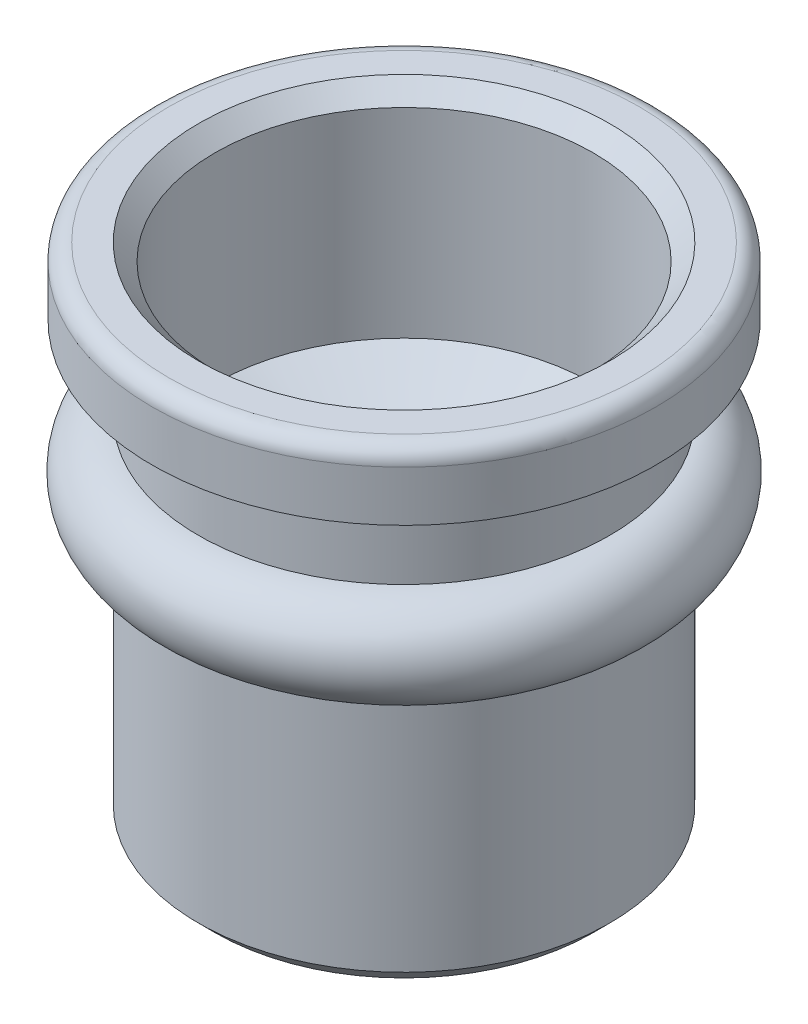
ISO-10303-21;
HEADER;
FILE_DESCRIPTION(('STEP AP214'),'2;1');
FILE_NAME('part.step','',(''),(''),'','','');
FILE_SCHEMA(('AUTOMOTIVE_DESIGN { 1 0 10303 214 1 1 1 1 }'));
ENDSEC;
DATA;
#1=APPLICATION_CONTEXT('core data for automotive mechanical design processes');
#2=APPLICATION_PROTOCOL_DEFINITION('international standard','automotive_design',2000,#1);
#3=PRODUCT_CONTEXT('',#1,'mechanical');
#4=PRODUCT('Part','Part','',(#3));
#5=PRODUCT_RELATED_PRODUCT_CATEGORY('part','',(#4));
#6=PRODUCT_DEFINITION_FORMATION('','',#4);
#7=PRODUCT_DEFINITION_CONTEXT('part definition',#1,'design');
#8=PRODUCT_DEFINITION('design','',#6,#7);
#9=PRODUCT_DEFINITION_SHAPE('','',#8);
#10=(LENGTH_UNIT() NAMED_UNIT(*) SI_UNIT(.MILLI.,.METRE.));
#11=(NAMED_UNIT(*) PLANE_ANGLE_UNIT() SI_UNIT($,.RADIAN.));
#12=(NAMED_UNIT(*) SI_UNIT($,.STERADIAN.) SOLID_ANGLE_UNIT());
#13=UNCERTAINTY_MEASURE_WITH_UNIT(LENGTH_MEASURE(1.E-05),#10,'distance_accuracy_value','');
#14=(GEOMETRIC_REPRESENTATION_CONTEXT(3) GLOBAL_UNCERTAINTY_ASSIGNED_CONTEXT((#13)) GLOBAL_UNIT_ASSIGNED_CONTEXT((#10,
#11,#12)) REPRESENTATION_CONTEXT('',''));
#15=CARTESIAN_POINT('',(0.,0.,0.));
#16=DIRECTION('',(0.,0.,1.));
#17=DIRECTION('',(1.,0.,0.));
#18=AXIS2_PLACEMENT_3D('',#15,#16,#17);
#19=CARTESIAN_POINT('',(0.,0.,0.));
#20=DIRECTION('',(0.,-1.,0.));
#21=DIRECTION('',(0.,0.,-1.));
#22=AXIS2_PLACEMENT_3D('',#19,#20,#21);
#23=CYLINDRICAL_SURFACE('',#22,2.45);
#24=CARTESIAN_POINT('',(0.,0.200000000000002,0.));
#25=DIRECTION('',(0.,-1.,0.));
#26=DIRECTION('',(0.,0.,-1.));
#27=AXIS2_PLACEMENT_3D('',#24,#25,#26);
#28=CIRCLE('',#27,2.45);
#29=CARTESIAN_POINT('',(0.,0.200000000000002,-2.45));
#30=VERTEX_POINT('',#29);
#31=EDGE_CURVE('E48',#30,#30,#28,.F.);
#32=ORIENTED_EDGE('',*,*,#31,.T.);
#33=EDGE_LOOP('',(#32));
#34=FACE_BOUND('',#33,.T.);
#35=CARTESIAN_POINT('',(0.,3.08,0.));
#36=DIRECTION('',(0.,-1.,0.));
#37=DIRECTION('',(0.,0.,-1.));
#38=AXIS2_PLACEMENT_3D('',#35,#36,#37);
#39=CIRCLE('',#38,2.45);
#40=CARTESIAN_POINT('',(0.,3.08,-2.45));
#41=VERTEX_POINT('',#40);
#42=EDGE_CURVE('E84',#41,#41,#39,.T.);
#43=ORIENTED_EDGE('',*,*,#42,.T.);
#44=EDGE_LOOP('',(#43));
#45=FACE_BOUND('',#44,.T.);
#46=ADVANCED_FACE('F36',(#34,#45),#23,.T.);
#47=CARTESIAN_POINT('',(0.,5.2,0.));
#48=DIRECTION('',(0.,-1.,0.));
#49=DIRECTION('',(0.,0.,-1.));
#50=AXIS2_PLACEMENT_3D('',#47,#48,#49);
#51=CIRCLE('',#50,2.45);
#52=CARTESIAN_POINT('',(0.,5.2,-2.45));
#53=VERTEX_POINT('',#52);
#54=EDGE_CURVE('E74',#53,#53,#51,.T.);
#55=ORIENTED_EDGE('',*,*,#54,.T.);
#56=EDGE_LOOP('',(#55));
#57=FACE_BOUND('',#56,.T.);
#58=CARTESIAN_POINT('',(0.,4.2,0.));
#59=DIRECTION('',(0.,-1.,0.));
#60=DIRECTION('',(0.,0.,-1.));
#61=AXIS2_PLACEMENT_3D('',#58,#59,#60);
#62=CIRCLE('',#61,2.45);
#63=CARTESIAN_POINT('',(0.,4.2,-2.45));
#64=VERTEX_POINT('',#63);
#65=EDGE_CURVE('E87',#64,#64,#62,.T.);
#66=ORIENTED_EDGE('',*,*,#65,.F.);
#67=EDGE_LOOP('',(#66));
#68=FACE_BOUND('',#67,.T.);
#69=ADVANCED_FACE('F93',(#57,#68),#23,.T.);
#70=CARTESIAN_POINT('',(0.,0.,0.));
#71=DIRECTION('',(0.,-1.,0.));
#72=DIRECTION('',(0.,0.,-1.));
#73=AXIS2_PLACEMENT_3D('',#70,#71,#72);
#74=CYLINDRICAL_SURFACE('',#73,1.24999999999999);
#75=CARTESIAN_POINT('',(0.,0.149999999999994,0.));
#76=DIRECTION('',(0.,-1.,0.));
#77=DIRECTION('',(0.,0.,-1.));
#78=AXIS2_PLACEMENT_3D('',#75,#76,#77);
#79=CIRCLE('',#78,1.24999999999999);
#80=CARTESIAN_POINT('',(0.,0.149999999999994,-1.24999999999999));
#81=VERTEX_POINT('',#80);
#82=EDGE_CURVE('E65',#81,#81,#79,.T.);
#83=ORIENTED_EDGE('',*,*,#82,.T.);
#84=EDGE_LOOP('',(#83));
#85=FACE_BOUND('',#84,.T.);
#86=CARTESIAN_POINT('',(0.,3.,0.));
#87=DIRECTION('',(0.,1.,0.));
#88=DIRECTION('',(0.,0.,1.));
#89=AXIS2_PLACEMENT_3D('',#86,#87,#88);
#90=CIRCLE('',#89,1.24999999999999);
#91=CARTESIAN_POINT('',(0.,3.,1.24999999999999));
#92=VERTEX_POINT('',#91);
#93=EDGE_CURVE('E58',#92,#92,#90,.F.);
#94=ORIENTED_EDGE('',*,*,#93,.F.);
#95=EDGE_LOOP('',(#94));
#96=FACE_BOUND('',#95,.T.);
#97=ADVANCED_FACE('F95',(#85,#96),#74,.F.);
#98=CARTESIAN_POINT('',(0.,0.,0.));
#99=DIRECTION('',(0.,-1.,0.));
#100=DIRECTION('',(0.,0.,-1.));
#101=AXIS2_PLACEMENT_3D('',#98,#99,#100);
#102=PLANE('',#101);
#103=CARTESIAN_POINT('',(0.,0.,0.));
#104=DIRECTION('',(0.,-1.,0.));
#105=DIRECTION('',(0.,0.,-1.));
#106=AXIS2_PLACEMENT_3D('',#103,#104,#105);
#107=CIRCLE('',#106,2.25);
#108=CARTESIAN_POINT('',(0.,0.,-2.25));
#109=VERTEX_POINT('',#108);
#110=EDGE_CURVE('E52',#109,#109,#107,.T.);
#111=ORIENTED_EDGE('',*,*,#110,.T.);
#112=EDGE_LOOP('',(#111));
#113=FACE_BOUND('',#112,.T.);
#114=CARTESIAN_POINT('',(0.,0.,0.));
#115=DIRECTION('',(0.,-1.,0.));
#116=DIRECTION('',(0.,0.,-1.));
#117=AXIS2_PLACEMENT_3D('',#114,#115,#116);
#118=CIRCLE('',#117,1.39999999999999);
#119=CARTESIAN_POINT('',(0.,0.,-1.39999999999999));
#120=VERTEX_POINT('',#119);
#121=EDGE_CURVE('E57',#120,#120,#118,.F.);
#122=ORIENTED_EDGE('',*,*,#121,.T.);
#123=EDGE_LOOP('',(#122));
#124=FACE_BOUND('',#123,.T.);
#125=ADVANCED_FACE('F102',(#113,#124),#102,.T.);
#126=CARTESIAN_POINT('',(2.45,5.2,0.));
#127=DIRECTION('',(0.,-1.,0.));
#128=DIRECTION('',(0.,0.,-1.));
#129=AXIS2_PLACEMENT_3D('',#126,#127,#128);
#130=PLANE('',#129);
#131=CARTESIAN_POINT('',(0.,5.2,0.));
#132=DIRECTION('',(0.,-1.,0.));
#133=DIRECTION('',(0.,0.,-1.));
#134=AXIS2_PLACEMENT_3D('',#131,#132,#133);
#135=CIRCLE('',#134,3.);
#136=CARTESIAN_POINT('',(0.,5.2,-3.));
#137=VERTEX_POINT('',#136);
#138=EDGE_CURVE('E61',#137,#137,#135,.T.);
#139=ORIENTED_EDGE('',*,*,#138,.T.);
#140=EDGE_LOOP('',(#139));
#141=FACE_BOUND('',#140,.T.);
#142=ORIENTED_EDGE('',*,*,#54,.F.);
#143=EDGE_LOOP('',(#142));
#144=FACE_BOUND('',#143,.T.);
#145=ADVANCED_FACE('F108',(#141,#144),#130,.T.);
#146=CARTESIAN_POINT('',(0.,0.,0.));
#147=DIRECTION('',(0.,-1.,0.));
#148=DIRECTION('',(0.,0.,-1.));
#149=AXIS2_PLACEMENT_3D('',#146,#147,#148);
#150=CYLINDRICAL_SURFACE('',#149,3.);
#151=CARTESIAN_POINT('',(0.,5.8,0.));
#152=DIRECTION('',(0.,1.,0.));
#153=DIRECTION('',(0.,0.,1.));
#154=AXIS2_PLACEMENT_3D('',#151,#152,#153);
#155=CIRCLE('',#154,3.);
#156=CARTESIAN_POINT('',(0.,5.8,3.));
#157=VERTEX_POINT('',#156);
#158=EDGE_CURVE('E71',#157,#157,#155,.F.);
#159=ORIENTED_EDGE('',*,*,#158,.T.);
#160=EDGE_LOOP('',(#159));
#161=FACE_BOUND('',#160,.T.);
#162=ORIENTED_EDGE('',*,*,#138,.F.);
#163=EDGE_LOOP('',(#162));
#164=FACE_BOUND('',#163,.T.);
#165=ADVANCED_FACE('F162',(#161,#164),#150,.T.);
#166=CARTESIAN_POINT('',(3.,6.,0.));
#167=DIRECTION('',(0.,1.,0.));
#168=DIRECTION('',(0.,0.,1.));
#169=AXIS2_PLACEMENT_3D('',#166,#167,#168);
#170=PLANE('',#169);
#171=CARTESIAN_POINT('',(0.,6.,0.));
#172=DIRECTION('',(0.,1.,0.));
#173=DIRECTION('',(0.,0.,1.));
#174=AXIS2_PLACEMENT_3D('',#171,#172,#173);
#175=CIRCLE('',#174,2.45);
#176=CARTESIAN_POINT('',(0.,6.,2.45));
#177=VERTEX_POINT('',#176);
#178=EDGE_CURVE('E10',#177,#177,#175,.F.);
#179=ORIENTED_EDGE('',*,*,#178,.T.);
#180=EDGE_LOOP('',(#179));
#181=FACE_BOUND('',#180,.T.);
#182=CARTESIAN_POINT('',(0.,6.,0.));
#183=DIRECTION('',(0.,1.,0.));
#184=DIRECTION('',(0.,0.,1.));
#185=AXIS2_PLACEMENT_3D('',#182,#183,#184);
#186=CIRCLE('',#185,2.8);
#187=CARTESIAN_POINT('',(0.,6.,2.8));
#188=VERTEX_POINT('',#187);
#189=EDGE_CURVE('E68',#188,#188,#186,.T.);
#190=ORIENTED_EDGE('',*,*,#189,.T.);
#191=EDGE_LOOP('',(#190));
#192=FACE_BOUND('',#191,.T.);
#193=ADVANCED_FACE('F117',(#181,#192),#170,.T.);
#194=CARTESIAN_POINT('',(0.,5.8,0.));
#195=DIRECTION('',(0.,1.,0.));
#196=DIRECTION('',(0.,0.,1.));
#197=AXIS2_PLACEMENT_3D('',#194,#195,#196);
#198=TOROIDAL_SURFACE('',#197,2.8,0.2);
#199=ORIENTED_EDGE('',*,*,#189,.F.);
#200=EDGE_LOOP('',(#199));
#201=FACE_BOUND('',#200,.T.);
#202=ORIENTED_EDGE('',*,*,#158,.F.);
#203=EDGE_LOOP('',(#202));
#204=FACE_BOUND('',#203,.T.);
#205=ADVANCED_FACE('F113',(#201,#204),#198,.T.);
#206=CARTESIAN_POINT('',(0.,0.149999999999994,0.));
#207=DIRECTION('',(0.,-1.,0.));
#208=DIRECTION('',(0.,0.,-1.));
#209=AXIS2_PLACEMENT_3D('',#206,#207,#208);
#210=CONICAL_SURFACE('',#209,1.24999999999999,0.785398163397451);
#211=ORIENTED_EDGE('',*,*,#121,.F.);
#212=EDGE_LOOP('',(#211));
#213=FACE_BOUND('',#212,.T.);
#214=ORIENTED_EDGE('',*,*,#82,.F.);
#215=EDGE_LOOP('',(#214));
#216=FACE_BOUND('',#215,.T.);
#217=ADVANCED_FACE('F116',(#213,#216),#210,.F.);
#218=CARTESIAN_POINT('',(1.35,3.,0.));
#219=DIRECTION('',(0.,1.,0.));
#220=DIRECTION('',(0.,0.,1.));
#221=AXIS2_PLACEMENT_3D('',#218,#219,#220);
#222=PLANE('',#221);
#223=CARTESIAN_POINT('',(0.,3.,0.));
#224=DIRECTION('',(0.,1.,0.));
#225=DIRECTION('',(0.,0.,1.));
#226=AXIS2_PLACEMENT_3D('',#223,#224,#225);
#227=CIRCLE('',#226,1.35);
#228=CARTESIAN_POINT('',(0.,3.,1.35));
#229=VERTEX_POINT('',#228);
#230=EDGE_CURVE('E81',#229,#229,#227,.T.);
#231=ORIENTED_EDGE('',*,*,#230,.T.);
#232=EDGE_LOOP('',(#231));
#233=FACE_BOUND('',#232,.T.);
#234=ORIENTED_EDGE('',*,*,#93,.T.);
#235=EDGE_LOOP('',(#234));
#236=FACE_BOUND('',#235,.T.);
#237=ADVANCED_FACE('F124',(#233,#236),#222,.T.);
#238=CARTESIAN_POINT('',(0.,6.,0.));
#239=DIRECTION('',(0.,1.,0.));
#240=DIRECTION('',(0.,0.,1.));
#241=AXIS2_PLACEMENT_3D('',#238,#239,#240);
#242=CYLINDRICAL_SURFACE('',#241,2.25);
#243=CARTESIAN_POINT('',(0.,5.8,0.));
#244=DIRECTION('',(0.,1.,0.));
#245=DIRECTION('',(0.,0.,1.));
#246=AXIS2_PLACEMENT_3D('',#243,#244,#245);
#247=CIRCLE('',#246,2.25);
#248=CARTESIAN_POINT('',(0.,5.8,2.25));
#249=VERTEX_POINT('',#248);
#250=EDGE_CURVE('E44',#249,#249,#247,.T.);
#251=ORIENTED_EDGE('',*,*,#250,.T.);
#252=EDGE_LOOP('',(#251));
#253=FACE_BOUND('',#252,.T.);
#254=CARTESIAN_POINT('',(0.,3.4196768923395,0.));
#255=DIRECTION('',(0.,1.,0.));
#256=DIRECTION('',(0.,0.,1.));
#257=AXIS2_PLACEMENT_3D('',#254,#255,#256);
#258=CIRCLE('',#257,2.25);
#259=CARTESIAN_POINT('',(0.,3.4196768923395,2.25));
#260=VERTEX_POINT('',#259);
#261=EDGE_CURVE('E62',#260,#260,#258,.T.);
#262=ORIENTED_EDGE('',*,*,#261,.F.);
#263=EDGE_LOOP('',(#262));
#264=FACE_BOUND('',#263,.T.);
#265=ADVANCED_FACE('F150',(#253,#264),#242,.F.);
#266=CARTESIAN_POINT('',(0.,3.,0.));
#267=DIRECTION('',(0.,1.,0.));
#268=DIRECTION('',(0.,0.,1.));
#269=AXIS2_PLACEMENT_3D('',#266,#267,#268);
#270=CONICAL_SURFACE('',#269,1.35,1.13446401379632);
#271=ORIENTED_EDGE('',*,*,#261,.T.);
#272=EDGE_LOOP('',(#271));
#273=FACE_BOUND('',#272,.T.);
#274=ORIENTED_EDGE('',*,*,#230,.F.);
#275=EDGE_LOOP('',(#274));
#276=FACE_BOUND('',#275,.T.);
#277=ADVANCED_FACE('F136',(#273,#276),#270,.F.);
#278=CARTESIAN_POINT('',(0.,3.64,0.));
#279=DIRECTION('',(0.,-1.,0.));
#280=DIRECTION('',(0.,0.,-1.));
#281=AXIS2_PLACEMENT_3D('',#278,#279,#280);
#282=TOROIDAL_SURFACE('',#281,2.45,0.56);
#283=ORIENTED_EDGE('',*,*,#42,.F.);
#284=EDGE_LOOP('',(#283));
#285=FACE_BOUND('',#284,.T.);
#286=ORIENTED_EDGE('',*,*,#65,.T.);
#287=EDGE_LOOP('',(#286));
#288=FACE_BOUND('',#287,.T.);
#289=ADVANCED_FACE('F91',(#285,#288),#282,.T.);
#290=CARTESIAN_POINT('',(0.,0.,0.));
#291=DIRECTION('',(0.,1.,0.));
#292=DIRECTION('',(0.,0.,1.));
#293=AXIS2_PLACEMENT_3D('',#290,#291,#292);
#294=CONICAL_SURFACE('',#293,2.25,0.785398163397444);
#295=ORIENTED_EDGE('',*,*,#31,.F.);
#296=EDGE_LOOP('',(#295));
#297=FACE_BOUND('',#296,.T.);
#298=ORIENTED_EDGE('',*,*,#110,.F.);
#299=EDGE_LOOP('',(#298));
#300=FACE_BOUND('',#299,.T.);
#301=ADVANCED_FACE('F126',(#297,#300),#294,.T.);
#302=CARTESIAN_POINT('',(0.,5.8,0.));
#303=DIRECTION('',(0.,1.,0.));
#304=DIRECTION('',(0.,0.,1.));
#305=AXIS2_PLACEMENT_3D('',#302,#303,#304);
#306=CONICAL_SURFACE('',#305,2.25,0.785398163397455);
#307=ORIENTED_EDGE('',*,*,#178,.F.);
#308=EDGE_LOOP('',(#307));
#309=FACE_BOUND('',#308,.T.);
#310=ORIENTED_EDGE('',*,*,#250,.F.);
#311=EDGE_LOOP('',(#310));
#312=FACE_BOUND('',#311,.T.);
#313=ADVANCED_FACE('F39',(#309,#312),#306,.F.);
#314=CLOSED_SHELL('',(#46,#69,#97,#125,#145,#165,#193,#205,#217,#237,#265,#277,#289,#301,#313));
#315=MANIFOLD_SOLID_BREP('B2',#314);
#316=ADVANCED_BREP_SHAPE_REPRESENTATION('',(#18,#315),#14);
#317=SHAPE_DEFINITION_REPRESENTATION(#9,#316);
ENDSEC;
END-ISO-10303-21;
